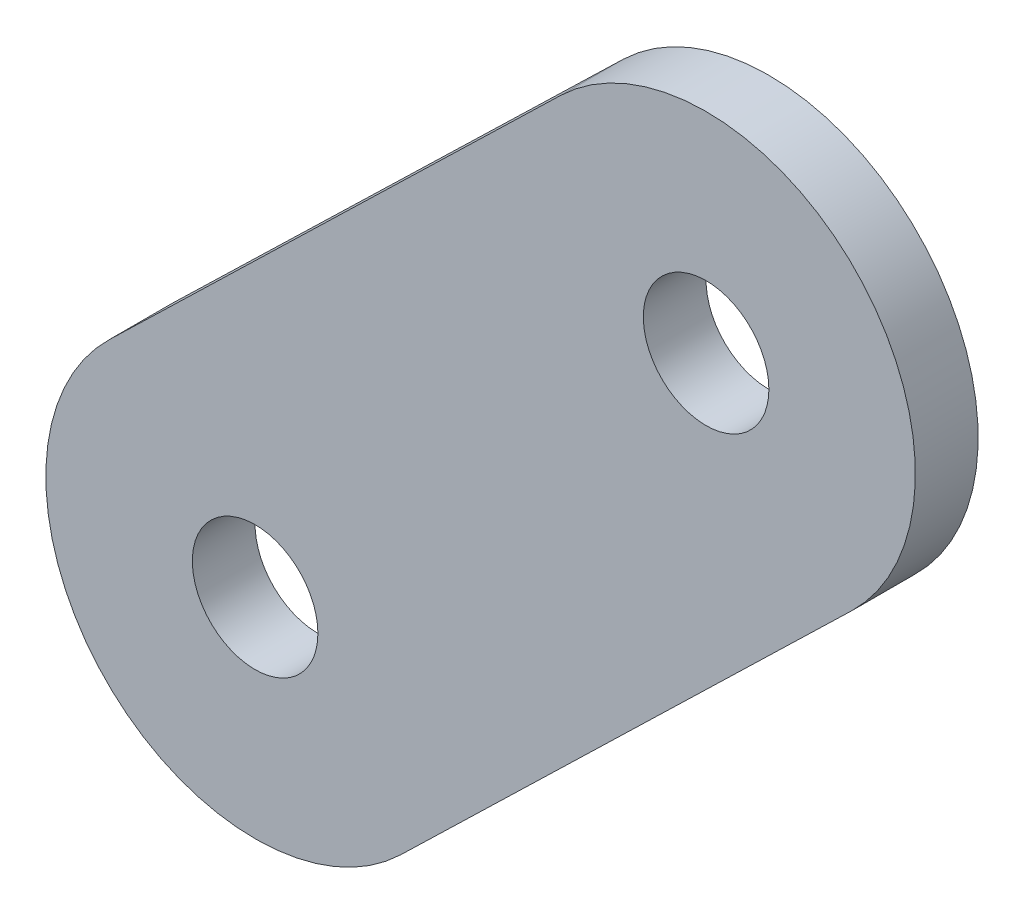
ISO-10303-21;
HEADER;
FILE_DESCRIPTION(('STEP AP214'),'2;1');
FILE_NAME('part.step','',(''),(''),'','','');
FILE_SCHEMA(('AUTOMOTIVE_DESIGN { 1 0 10303 214 1 1 1 1 }'));
ENDSEC;
DATA;
#1=APPLICATION_CONTEXT('core data for automotive mechanical design processes');
#2=APPLICATION_PROTOCOL_DEFINITION('international standard','automotive_design',2000,#1);
#3=PRODUCT_CONTEXT('',#1,'mechanical');
#4=PRODUCT('Part','Part','',(#3));
#5=PRODUCT_RELATED_PRODUCT_CATEGORY('part','',(#4));
#6=PRODUCT_DEFINITION_FORMATION('','',#4);
#7=PRODUCT_DEFINITION_CONTEXT('part definition',#1,'design');
#8=PRODUCT_DEFINITION('design','',#6,#7);
#9=PRODUCT_DEFINITION_SHAPE('','',#8);
#10=(LENGTH_UNIT() NAMED_UNIT(*) SI_UNIT(.MILLI.,.METRE.));
#11=(NAMED_UNIT(*) PLANE_ANGLE_UNIT() SI_UNIT($,.RADIAN.));
#12=(NAMED_UNIT(*) SI_UNIT($,.STERADIAN.) SOLID_ANGLE_UNIT());
#13=UNCERTAINTY_MEASURE_WITH_UNIT(LENGTH_MEASURE(1.E-05),#10,'distance_accuracy_value','');
#14=(GEOMETRIC_REPRESENTATION_CONTEXT(3) GLOBAL_UNCERTAINTY_ASSIGNED_CONTEXT((#13)) GLOBAL_UNIT_ASSIGNED_CONTEXT((#10,
#11,#12)) REPRESENTATION_CONTEXT('',''));
#15=CARTESIAN_POINT('',(0.,0.,0.));
#16=DIRECTION('',(0.,0.,1.));
#17=DIRECTION('',(1.,0.,0.));
#18=AXIS2_PLACEMENT_3D('',#15,#16,#17);
#19=CARTESIAN_POINT('',(24.1546002977251,42.4770759280145,3.));
#20=DIRECTION('',(0.,0.,1.));
#21=DIRECTION('',(1.,0.,0.));
#22=AXIS2_PLACEMENT_3D('',#19,#20,#21);
#23=PLANE('',#22);
#24=CARTESIAN_POINT('',(24.1546002977251,42.4770759280145,3.));
#25=DIRECTION('',(0.,0.,1.));
#26=DIRECTION('',(1.,0.,0.));
#27=AXIS2_PLACEMENT_3D('',#24,#25,#26);
#28=CIRCLE('',#27,3.);
#29=CARTESIAN_POINT('',(27.1546002977251,42.4770759280145,3.));
#30=VERTEX_POINT('',#29);
#31=EDGE_CURVE('E104',#30,#30,#28,.T.);
#32=ORIENTED_EDGE('',*,*,#31,.F.);
#33=EDGE_LOOP('',(#32));
#34=FACE_BOUND('',#33,.T.);
#35=CARTESIAN_POINT('',(24.1546002977251,42.4770759280145,3.));
#36=DIRECTION('',(0.,0.,1.));
#37=DIRECTION('',(1.,0.,0.));
#38=AXIS2_PLACEMENT_3D('',#35,#36,#37);
#39=CIRCLE('',#38,10.);
#40=CARTESIAN_POINT('',(17.1973754155377,49.6601826332412,3.));
#41=VERTEX_POINT('',#40);
#42=CARTESIAN_POINT('',(31.1118251799125,35.2939692227878,3.));
#43=VERTEX_POINT('',#42);
#44=EDGE_CURVE('E89',#41,#43,#39,.T.);
#45=ORIENTED_EDGE('',*,*,#44,.T.);
#46=DIRECTION('',(0.71831067052267,0.695722488218738,0.));
#47=VECTOR('',#46,1.);
#48=CARTESIAN_POINT('',(31.1118251799125,35.2939692227878,3.));
#49=LINE('',#48,#47);
#50=CARTESIAN_POINT('',(52.6611452955926,56.16564386935,3.));
#51=VERTEX_POINT('',#50);
#52=EDGE_CURVE('E84',#43,#51,#49,.T.);
#53=ORIENTED_EDGE('',*,*,#52,.T.);
#54=CARTESIAN_POINT('',(45.7039204134052,63.3487505745766,3.));
#55=DIRECTION('',(0.,0.,1.));
#56=DIRECTION('',(1.,0.,0.));
#57=AXIS2_PLACEMENT_3D('',#54,#55,#56);
#58=CIRCLE('',#57,9.99999999999999);
#59=CARTESIAN_POINT('',(38.7466955312179,70.5318572798033,3.));
#60=VERTEX_POINT('',#59);
#61=EDGE_CURVE('E87',#51,#60,#58,.T.);
#62=ORIENTED_EDGE('',*,*,#61,.T.);
#63=DIRECTION('',(-0.718310670522671,-0.695722488218737,0.));
#64=VECTOR('',#63,1.);
#65=CARTESIAN_POINT('',(17.1973754155377,49.6601826332412,3.));
#66=LINE('',#65,#64);
#67=EDGE_CURVE('E54',#60,#41,#66,.T.);
#68=ORIENTED_EDGE('',*,*,#67,.T.);
#69=EDGE_LOOP('',(#45,#53,#62,#68));
#70=FACE_BOUND('',#69,.T.);
#71=CARTESIAN_POINT('',(45.7039204134052,63.3487505745766,3.));
#72=DIRECTION('',(0.,0.,1.));
#73=DIRECTION('',(1.,0.,0.));
#74=AXIS2_PLACEMENT_3D('',#71,#72,#73);
#75=CIRCLE('',#74,3.);
#76=CARTESIAN_POINT('',(48.7039204134052,63.3487505745766,3.));
#77=VERTEX_POINT('',#76);
#78=EDGE_CURVE('E119',#77,#77,#75,.T.);
#79=ORIENTED_EDGE('',*,*,#78,.F.);
#80=EDGE_LOOP('',(#79));
#81=FACE_BOUND('',#80,.T.);
#82=ADVANCED_FACE('F37',(#34,#70,#81),#23,.T.);
#83=CARTESIAN_POINT('',(24.1546002977251,42.4770759280145,0.));
#84=DIRECTION('',(0.,0.,1.));
#85=DIRECTION('',(1.,0.,0.));
#86=AXIS2_PLACEMENT_3D('',#83,#84,#85);
#87=PLANE('',#86);
#88=CARTESIAN_POINT('',(24.1546002977251,42.4770759280145,0.));
#89=DIRECTION('',(0.,0.,1.));
#90=DIRECTION('',(1.,0.,0.));
#91=AXIS2_PLACEMENT_3D('',#88,#89,#90);
#92=CIRCLE('',#91,10.);
#93=CARTESIAN_POINT('',(17.1973754155377,49.6601826332412,0.));
#94=VERTEX_POINT('',#93);
#95=CARTESIAN_POINT('',(31.1118251799125,35.2939692227878,0.));
#96=VERTEX_POINT('',#95);
#97=EDGE_CURVE('E101',#94,#96,#92,.T.);
#98=ORIENTED_EDGE('',*,*,#97,.F.);
#99=DIRECTION('',(-0.718310670522671,-0.695722488218737,0.));
#100=VECTOR('',#99,1.);
#101=CARTESIAN_POINT('',(17.1973754155377,49.6601826332412,0.));
#102=LINE('',#101,#100);
#103=CARTESIAN_POINT('',(38.7466955312179,70.5318572798033,0.));
#104=VERTEX_POINT('',#103);
#105=EDGE_CURVE('E77',#104,#94,#102,.T.);
#106=ORIENTED_EDGE('',*,*,#105,.F.);
#107=CARTESIAN_POINT('',(45.7039204134052,63.3487505745766,0.));
#108=DIRECTION('',(0.,0.,1.));
#109=DIRECTION('',(1.,0.,0.));
#110=AXIS2_PLACEMENT_3D('',#107,#108,#109);
#111=CIRCLE('',#110,9.99999999999999);
#112=CARTESIAN_POINT('',(52.6611452955926,56.16564386935,0.));
#113=VERTEX_POINT('',#112);
#114=EDGE_CURVE('E71',#113,#104,#111,.T.);
#115=ORIENTED_EDGE('',*,*,#114,.F.);
#116=DIRECTION('',(0.71831067052267,0.695722488218738,0.));
#117=VECTOR('',#116,1.);
#118=CARTESIAN_POINT('',(31.1118251799125,35.2939692227878,0.));
#119=LINE('',#118,#117);
#120=EDGE_CURVE('E93',#96,#113,#119,.T.);
#121=ORIENTED_EDGE('',*,*,#120,.F.);
#122=EDGE_LOOP('',(#98,#106,#115,#121));
#123=FACE_BOUND('',#122,.T.);
#124=CARTESIAN_POINT('',(24.1546002977251,42.4770759280145,0.));
#125=DIRECTION('',(0.,0.,1.));
#126=DIRECTION('',(1.,0.,0.));
#127=AXIS2_PLACEMENT_3D('',#124,#125,#126);
#128=CIRCLE('',#127,3.);
#129=CARTESIAN_POINT('',(27.1546002977251,42.4770759280145,0.));
#130=VERTEX_POINT('',#129);
#131=EDGE_CURVE('E116',#130,#130,#128,.T.);
#132=ORIENTED_EDGE('',*,*,#131,.T.);
#133=EDGE_LOOP('',(#132));
#134=FACE_BOUND('',#133,.T.);
#135=CARTESIAN_POINT('',(45.7039204134052,63.3487505745766,0.));
#136=DIRECTION('',(0.,0.,1.));
#137=DIRECTION('',(1.,0.,0.));
#138=AXIS2_PLACEMENT_3D('',#135,#136,#137);
#139=CIRCLE('',#138,3.);
#140=CARTESIAN_POINT('',(48.7039204134052,63.3487505745766,0.));
#141=VERTEX_POINT('',#140);
#142=EDGE_CURVE('E122',#141,#141,#139,.T.);
#143=ORIENTED_EDGE('',*,*,#142,.T.);
#144=EDGE_LOOP('',(#143));
#145=FACE_BOUND('',#144,.T.);
#146=ADVANCED_FACE('F112',(#123,#134,#145),#87,.F.);
#147=CARTESIAN_POINT('',(24.1546002977251,42.4770759280145,3.));
#148=DIRECTION('',(0.,0.,-1.));
#149=DIRECTION('',(-1.,0.,0.));
#150=AXIS2_PLACEMENT_3D('',#147,#148,#149);
#151=CYLINDRICAL_SURFACE('',#150,10.);
#152=ORIENTED_EDGE('',*,*,#97,.T.);
#153=DIRECTION('',(0.,0.,-1.));
#154=VECTOR('',#153,1.);
#155=CARTESIAN_POINT('',(31.1118251799125,35.2939692227878,3.));
#156=LINE('',#155,#154);
#157=EDGE_CURVE('E11',#43,#96,#156,.T.);
#158=ORIENTED_EDGE('',*,*,#157,.F.);
#159=ORIENTED_EDGE('',*,*,#44,.F.);
#160=DIRECTION('',(0.,0.,-1.));
#161=VECTOR('',#160,1.);
#162=CARTESIAN_POINT('',(17.1973754155377,49.6601826332412,3.));
#163=LINE('',#162,#161);
#164=EDGE_CURVE('E97',#41,#94,#163,.T.);
#165=ORIENTED_EDGE('',*,*,#164,.T.);
#166=EDGE_LOOP('',(#152,#158,#159,#165));
#167=FACE_BOUND('',#166,.T.);
#168=ADVANCED_FACE('F39',(#167),#151,.T.);
#169=CARTESIAN_POINT('',(31.1118251799125,35.2939692227878,3.));
#170=DIRECTION('',(-0.695722488218738,0.71831067052267,0.));
#171=DIRECTION('',(-0.71831067052267,-0.695722488218738,0.));
#172=AXIS2_PLACEMENT_3D('',#169,#170,#171);
#173=PLANE('',#172);
#174=ORIENTED_EDGE('',*,*,#120,.T.);
#175=DIRECTION('',(0.,0.,-1.));
#176=VECTOR('',#175,1.);
#177=CARTESIAN_POINT('',(52.6611452955926,56.16564386935,3.));
#178=LINE('',#177,#176);
#179=EDGE_CURVE('E46',#51,#113,#178,.T.);
#180=ORIENTED_EDGE('',*,*,#179,.F.);
#181=ORIENTED_EDGE('',*,*,#52,.F.);
#182=ORIENTED_EDGE('',*,*,#157,.T.);
#183=EDGE_LOOP('',(#174,#180,#181,#182));
#184=FACE_BOUND('',#183,.T.);
#185=ADVANCED_FACE('F92',(#184),#173,.F.);
#186=CARTESIAN_POINT('',(45.7039204134052,63.3487505745766,3.));
#187=DIRECTION('',(0.,0.,-1.));
#188=DIRECTION('',(-1.,0.,0.));
#189=AXIS2_PLACEMENT_3D('',#186,#187,#188);
#190=CYLINDRICAL_SURFACE('',#189,9.99999999999999);
#191=ORIENTED_EDGE('',*,*,#114,.T.);
#192=DIRECTION('',(0.,0.,-1.));
#193=VECTOR('',#192,1.);
#194=CARTESIAN_POINT('',(38.7466955312179,70.5318572798033,3.));
#195=LINE('',#194,#193);
#196=EDGE_CURVE('E94',#60,#104,#195,.T.);
#197=ORIENTED_EDGE('',*,*,#196,.F.);
#198=ORIENTED_EDGE('',*,*,#61,.F.);
#199=ORIENTED_EDGE('',*,*,#179,.T.);
#200=EDGE_LOOP('',(#191,#197,#198,#199));
#201=FACE_BOUND('',#200,.T.);
#202=ADVANCED_FACE('F95',(#201),#190,.T.);
#203=CARTESIAN_POINT('',(17.1973754155377,49.6601826332412,3.));
#204=DIRECTION('',(0.695722488218737,-0.718310670522671,0.));
#205=DIRECTION('',(0.718310670522671,0.695722488218737,0.));
#206=AXIS2_PLACEMENT_3D('',#203,#204,#205);
#207=PLANE('',#206);
#208=ORIENTED_EDGE('',*,*,#105,.T.);
#209=ORIENTED_EDGE('',*,*,#164,.F.);
#210=ORIENTED_EDGE('',*,*,#67,.F.);
#211=ORIENTED_EDGE('',*,*,#196,.T.);
#212=EDGE_LOOP('',(#208,#209,#210,#211));
#213=FACE_BOUND('',#212,.T.);
#214=ADVANCED_FACE('F109',(#213),#207,.F.);
#215=CARTESIAN_POINT('',(24.1546002977251,42.4770759280145,3.));
#216=DIRECTION('',(0.,0.,-1.));
#217=DIRECTION('',(-1.,0.,0.));
#218=AXIS2_PLACEMENT_3D('',#215,#216,#217);
#219=CYLINDRICAL_SURFACE('',#218,3.);
#220=ORIENTED_EDGE('',*,*,#31,.T.);
#221=EDGE_LOOP('',(#220));
#222=FACE_BOUND('',#221,.T.);
#223=ORIENTED_EDGE('',*,*,#131,.F.);
#224=EDGE_LOOP('',(#223));
#225=FACE_BOUND('',#224,.T.);
#226=ADVANCED_FACE('F139',(#222,#225),#219,.F.);
#227=CARTESIAN_POINT('',(45.7039204134052,63.3487505745766,3.));
#228=DIRECTION('',(0.,0.,-1.));
#229=DIRECTION('',(-1.,0.,0.));
#230=AXIS2_PLACEMENT_3D('',#227,#228,#229);
#231=CYLINDRICAL_SURFACE('',#230,3.);
#232=ORIENTED_EDGE('',*,*,#78,.T.);
#233=EDGE_LOOP('',(#232));
#234=FACE_BOUND('',#233,.T.);
#235=ORIENTED_EDGE('',*,*,#142,.F.);
#236=EDGE_LOOP('',(#235));
#237=FACE_BOUND('',#236,.T.);
#238=ADVANCED_FACE('F128',(#234,#237),#231,.F.);
#239=CLOSED_SHELL('',(#82,#146,#168,#185,#202,#214,#226,#238));
#240=MANIFOLD_SOLID_BREP('B2',#239);
#241=ADVANCED_BREP_SHAPE_REPRESENTATION('',(#18,#240),#14);
#242=SHAPE_DEFINITION_REPRESENTATION(#9,#241);
ENDSEC;
END-ISO-10303-21;
